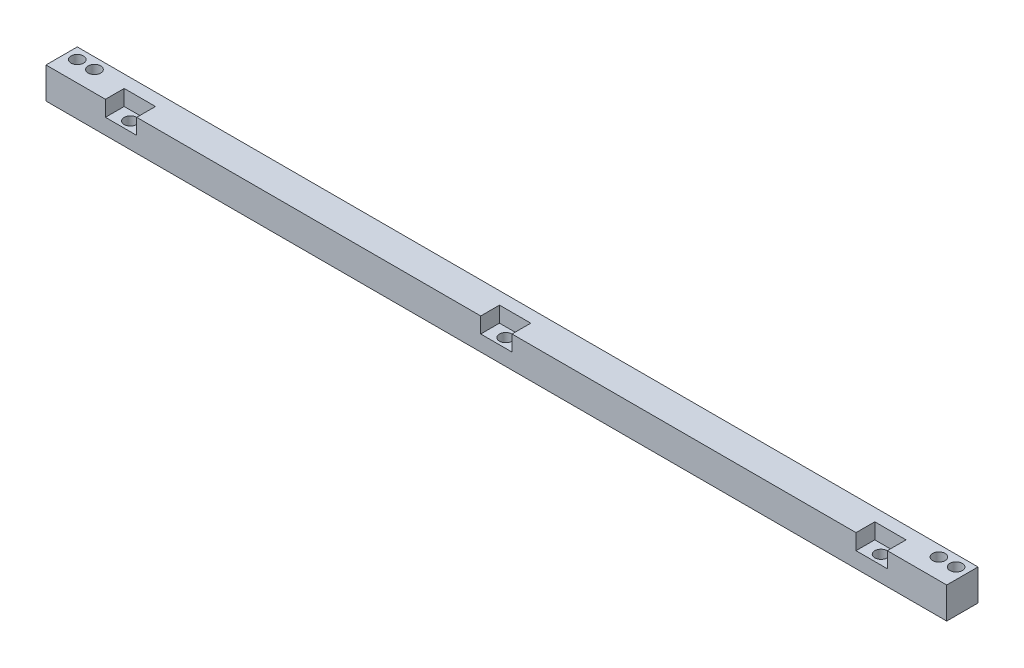
ISO-10303-21;
HEADER;
FILE_DESCRIPTION(('STEP AP214'),'2;1');
FILE_NAME('part.step','',(''),(''),'','','');
FILE_SCHEMA(('AUTOMOTIVE_DESIGN { 1 0 10303 214 1 1 1 1 }'));
ENDSEC;
DATA;
#1=APPLICATION_CONTEXT('core data for automotive mechanical design processes');
#2=APPLICATION_PROTOCOL_DEFINITION('international standard','automotive_design',2000,#1);
#3=PRODUCT_CONTEXT('',#1,'mechanical');
#4=PRODUCT('Part','Part','',(#3));
#5=PRODUCT_RELATED_PRODUCT_CATEGORY('part','',(#4));
#6=PRODUCT_DEFINITION_FORMATION('','',#4);
#7=PRODUCT_DEFINITION_CONTEXT('part definition',#1,'design');
#8=PRODUCT_DEFINITION('design','',#6,#7);
#9=PRODUCT_DEFINITION_SHAPE('','',#8);
#10=(LENGTH_UNIT() NAMED_UNIT(*) SI_UNIT(.MILLI.,.METRE.));
#11=(NAMED_UNIT(*) PLANE_ANGLE_UNIT() SI_UNIT($,.RADIAN.));
#12=(NAMED_UNIT(*) SI_UNIT($,.STERADIAN.) SOLID_ANGLE_UNIT());
#13=UNCERTAINTY_MEASURE_WITH_UNIT(LENGTH_MEASURE(1.E-05),#10,'distance_accuracy_value','');
#14=(GEOMETRIC_REPRESENTATION_CONTEXT(3) GLOBAL_UNCERTAINTY_ASSIGNED_CONTEXT((#13)) GLOBAL_UNIT_ASSIGNED_CONTEXT((#10,
#11,#12)) REPRESENTATION_CONTEXT('',''));
#15=CARTESIAN_POINT('',(0.,0.,0.));
#16=DIRECTION('',(0.,0.,1.));
#17=DIRECTION('',(1.,0.,0.));
#18=AXIS2_PLACEMENT_3D('',#15,#16,#17);
#19=CARTESIAN_POINT('',(0.,25.4,0.));
#20=DIRECTION('',(1.,0.,0.));
#21=DIRECTION('',(0.,0.,-1.));
#22=AXIS2_PLACEMENT_3D('',#19,#20,#21);
#23=PLANE('',#22);
#24=DIRECTION('',(0.,0.,1.));
#25=VECTOR('',#24,1.);
#26=CARTESIAN_POINT('',(0.,0.,0.));
#27=LINE('',#26,#25);
#28=CARTESIAN_POINT('',(0.,0.,-25.4));
#29=VERTEX_POINT('',#28);
#30=CARTESIAN_POINT('',(0.,0.,0.));
#31=VERTEX_POINT('',#30);
#32=EDGE_CURVE('E269',#29,#31,#27,.T.);
#33=ORIENTED_EDGE('',*,*,#32,.T.);
#34=DIRECTION('',(0.,-1.,0.));
#35=VECTOR('',#34,1.);
#36=CARTESIAN_POINT('',(0.,25.4,0.));
#37=LINE('',#36,#35);
#38=CARTESIAN_POINT('',(0.,25.4,0.));
#39=VERTEX_POINT('',#38);
#40=EDGE_CURVE('E11',#39,#31,#37,.T.);
#41=ORIENTED_EDGE('',*,*,#40,.F.);
#42=DIRECTION('',(0.,0.,1.));
#43=VECTOR('',#42,1.);
#44=CARTESIAN_POINT('',(0.,25.4,0.));
#45=LINE('',#44,#43);
#46=CARTESIAN_POINT('',(0.,25.4,-25.4));
#47=VERTEX_POINT('',#46);
#48=EDGE_CURVE('E255',#47,#39,#45,.T.);
#49=ORIENTED_EDGE('',*,*,#48,.F.);
#50=DIRECTION('',(0.,-1.,0.));
#51=VECTOR('',#50,1.);
#52=CARTESIAN_POINT('',(0.,25.4,-25.4));
#53=LINE('',#52,#51);
#54=EDGE_CURVE('E268',#47,#29,#53,.T.);
#55=ORIENTED_EDGE('',*,*,#54,.T.);
#56=EDGE_LOOP('',(#33,#41,#49,#55));
#57=FACE_BOUND('',#56,.T.);
#58=ADVANCED_FACE('F33',(#57),#23,.F.);
#59=CARTESIAN_POINT('',(0.,25.4,0.));
#60=DIRECTION('',(0.,0.,-1.));
#61=DIRECTION('',(-1.,0.,0.));
#62=AXIS2_PLACEMENT_3D('',#59,#60,#61);
#63=PLANE('',#62);
#64=DIRECTION('',(1.,0.,0.));
#65=VECTOR('',#64,1.);
#66=CARTESIAN_POINT('',(0.,25.4,0.));
#67=LINE('',#66,#65);
#68=CARTESIAN_POINT('',(683.26,25.4,0.));
#69=VERTEX_POINT('',#68);
#70=CARTESIAN_POINT('',(731.52,25.4,0.));
#71=VERTEX_POINT('',#70);
#72=EDGE_CURVE('E258',#69,#71,#67,.T.);
#73=ORIENTED_EDGE('',*,*,#72,.F.);
#74=DIRECTION('',(0.,1.,0.));
#75=VECTOR('',#74,1.);
#76=CARTESIAN_POINT('',(683.26,12.7,0.));
#77=LINE('',#76,#75);
#78=CARTESIAN_POINT('',(683.26,12.7,0.));
#79=VERTEX_POINT('',#78);
#80=EDGE_CURVE('E180',#79,#69,#77,.T.);
#81=ORIENTED_EDGE('',*,*,#80,.F.);
#82=DIRECTION('',(1.,0.,0.));
#83=VECTOR('',#82,1.);
#84=CARTESIAN_POINT('',(683.26,12.7,0.));
#85=LINE('',#84,#83);
#86=CARTESIAN_POINT('',(657.86,12.7,0.));
#87=VERTEX_POINT('',#86);
#88=EDGE_CURVE('E154',#87,#79,#85,.T.);
#89=ORIENTED_EDGE('',*,*,#88,.F.);
#90=DIRECTION('',(0.,1.,0.));
#91=VECTOR('',#90,1.);
#92=CARTESIAN_POINT('',(657.86,12.7,0.));
#93=LINE('',#92,#91);
#94=CARTESIAN_POINT('',(657.86,25.4,0.));
#95=VERTEX_POINT('',#94);
#96=EDGE_CURVE('E183',#87,#95,#93,.T.);
#97=ORIENTED_EDGE('',*,*,#96,.T.);
#98=CARTESIAN_POINT('',(378.46,25.4,0.));
#99=VERTEX_POINT('',#98);
#100=EDGE_CURVE('E330',#99,#95,#67,.T.);
#101=ORIENTED_EDGE('',*,*,#100,.F.);
#102=DIRECTION('',(0.,1.,0.));
#103=VECTOR('',#102,1.);
#104=CARTESIAN_POINT('',(378.46,12.7,0.));
#105=LINE('',#104,#103);
#106=CARTESIAN_POINT('',(378.46,12.7,0.));
#107=VERTEX_POINT('',#106);
#108=EDGE_CURVE('E178',#107,#99,#105,.T.);
#109=ORIENTED_EDGE('',*,*,#108,.F.);
#110=DIRECTION('',(1.,0.,0.));
#111=VECTOR('',#110,1.);
#112=CARTESIAN_POINT('',(353.06,12.7,0.));
#113=LINE('',#112,#111);
#114=CARTESIAN_POINT('',(353.06,12.7,0.));
#115=VERTEX_POINT('',#114);
#116=EDGE_CURVE('E197',#115,#107,#113,.T.);
#117=ORIENTED_EDGE('',*,*,#116,.F.);
#118=DIRECTION('',(0.,1.,0.));
#119=VECTOR('',#118,1.);
#120=CARTESIAN_POINT('',(353.06,12.7,0.));
#121=LINE('',#120,#119);
#122=CARTESIAN_POINT('',(353.06,25.4,0.));
#123=VERTEX_POINT('',#122);
#124=EDGE_CURVE('E207',#115,#123,#121,.T.);
#125=ORIENTED_EDGE('',*,*,#124,.T.);
#126=CARTESIAN_POINT('',(73.66,25.4,0.));
#127=VERTEX_POINT('',#126);
#128=EDGE_CURVE('E264',#127,#123,#67,.T.);
#129=ORIENTED_EDGE('',*,*,#128,.F.);
#130=DIRECTION('',(0.,1.,0.));
#131=VECTOR('',#130,1.);
#132=CARTESIAN_POINT('',(73.66,12.7,0.));
#133=LINE('',#132,#131);
#134=CARTESIAN_POINT('',(73.66,12.7,0.));
#135=VERTEX_POINT('',#134);
#136=EDGE_CURVE('E238',#135,#127,#133,.T.);
#137=ORIENTED_EDGE('',*,*,#136,.F.);
#138=DIRECTION('',(1.,0.,0.));
#139=VECTOR('',#138,1.);
#140=CARTESIAN_POINT('',(48.26,12.7,0.));
#141=LINE('',#140,#139);
#142=CARTESIAN_POINT('',(48.26,12.7,0.));
#143=VERTEX_POINT('',#142);
#144=EDGE_CURVE('E216',#143,#135,#141,.T.);
#145=ORIENTED_EDGE('',*,*,#144,.F.);
#146=DIRECTION('',(0.,1.,0.));
#147=VECTOR('',#146,1.);
#148=CARTESIAN_POINT('',(48.26,12.7,0.));
#149=LINE('',#148,#147);
#150=CARTESIAN_POINT('',(48.26,25.4,0.));
#151=VERTEX_POINT('',#150);
#152=EDGE_CURVE('E226',#143,#151,#149,.T.);
#153=ORIENTED_EDGE('',*,*,#152,.T.);
#154=EDGE_CURVE('E260',#39,#151,#67,.T.);
#155=ORIENTED_EDGE('',*,*,#154,.F.);
#156=ORIENTED_EDGE('',*,*,#40,.T.);
#157=DIRECTION('',(1.,0.,0.));
#158=VECTOR('',#157,1.);
#159=CARTESIAN_POINT('',(0.,0.,0.));
#160=LINE('',#159,#158);
#161=CARTESIAN_POINT('',(731.52,0.,0.));
#162=VERTEX_POINT('',#161);
#163=EDGE_CURVE('E272',#31,#162,#160,.T.);
#164=ORIENTED_EDGE('',*,*,#163,.T.);
#165=DIRECTION('',(0.,-1.,0.));
#166=VECTOR('',#165,1.);
#167=CARTESIAN_POINT('',(731.52,25.4,0.));
#168=LINE('',#167,#166);
#169=EDGE_CURVE('E41',#71,#162,#168,.T.);
#170=ORIENTED_EDGE('',*,*,#169,.F.);
#171=EDGE_LOOP('',(#73,#81,#89,#97,#101,#109,#117,#125,#129,#137,#145,#153,#155,#156,#164,#170));
#172=FACE_BOUND('',#171,.T.);
#173=ADVANCED_FACE('F326',(#172),#63,.F.);
#174=CARTESIAN_POINT('',(731.52,25.4,0.));
#175=DIRECTION('',(-1.,0.,0.));
#176=DIRECTION('',(0.,0.,1.));
#177=AXIS2_PLACEMENT_3D('',#174,#175,#176);
#178=PLANE('',#177);
#179=DIRECTION('',(0.,0.,-1.));
#180=VECTOR('',#179,1.);
#181=CARTESIAN_POINT('',(731.52,0.,0.));
#182=LINE('',#181,#180);
#183=CARTESIAN_POINT('',(731.52,0.,-25.4));
#184=VERTEX_POINT('',#183);
#185=EDGE_CURVE('E274',#162,#184,#182,.T.);
#186=ORIENTED_EDGE('',*,*,#185,.T.);
#187=DIRECTION('',(0.,-1.,0.));
#188=VECTOR('',#187,1.);
#189=CARTESIAN_POINT('',(731.52,25.4,-25.4));
#190=LINE('',#189,#188);
#191=CARTESIAN_POINT('',(731.52,25.4,-25.4));
#192=VERTEX_POINT('',#191);
#193=EDGE_CURVE('E279',#192,#184,#190,.T.);
#194=ORIENTED_EDGE('',*,*,#193,.F.);
#195=DIRECTION('',(0.,0.,-1.));
#196=VECTOR('',#195,1.);
#197=CARTESIAN_POINT('',(731.52,25.4,0.));
#198=LINE('',#197,#196);
#199=EDGE_CURVE('E263',#71,#192,#198,.T.);
#200=ORIENTED_EDGE('',*,*,#199,.F.);
#201=ORIENTED_EDGE('',*,*,#169,.T.);
#202=EDGE_LOOP('',(#186,#194,#200,#201));
#203=FACE_BOUND('',#202,.T.);
#204=ADVANCED_FACE('F322',(#203),#178,.F.);
#205=CARTESIAN_POINT('',(0.,25.4,-25.4));
#206=DIRECTION('',(0.,0.,1.));
#207=DIRECTION('',(1.,0.,0.));
#208=AXIS2_PLACEMENT_3D('',#205,#206,#207);
#209=PLANE('',#208);
#210=DIRECTION('',(-1.,0.,0.));
#211=VECTOR('',#210,1.);
#212=CARTESIAN_POINT('',(0.,0.,-25.4));
#213=LINE('',#212,#211);
#214=EDGE_CURVE('E259',#184,#29,#213,.T.);
#215=ORIENTED_EDGE('',*,*,#214,.T.);
#216=ORIENTED_EDGE('',*,*,#54,.F.);
#217=DIRECTION('',(-1.,0.,0.));
#218=VECTOR('',#217,1.);
#219=CARTESIAN_POINT('',(0.,25.4,-25.4));
#220=LINE('',#219,#218);
#221=EDGE_CURVE('E266',#192,#47,#220,.T.);
#222=ORIENTED_EDGE('',*,*,#221,.F.);
#223=ORIENTED_EDGE('',*,*,#193,.T.);
#224=EDGE_LOOP('',(#215,#216,#222,#223));
#225=FACE_BOUND('',#224,.T.);
#226=ADVANCED_FACE('F318',(#225),#209,.F.);
#227=CARTESIAN_POINT('',(0.,25.4,0.));
#228=DIRECTION('',(0.,-1.,0.));
#229=DIRECTION('',(0.,0.,-1.));
#230=AXIS2_PLACEMENT_3D('',#227,#228,#229);
#231=PLANE('',#230);
#232=CARTESIAN_POINT('',(22.86,25.4,-16.51));
#233=DIRECTION('',(0.,1.,0.));
#234=DIRECTION('',(0.,0.,1.));
#235=AXIS2_PLACEMENT_3D('',#232,#233,#234);
#236=CIRCLE('',#235,5.08);
#237=CARTESIAN_POINT('',(22.86,25.4,-11.43));
#238=VERTEX_POINT('',#237);
#239=EDGE_CURVE('E242',#238,#238,#236,.T.);
#240=ORIENTED_EDGE('',*,*,#239,.F.);
#241=EDGE_LOOP('',(#240));
#242=FACE_BOUND('',#241,.T.);
#243=CARTESIAN_POINT('',(722.63,25.4,-16.51));
#244=DIRECTION('',(0.,1.,0.));
#245=DIRECTION('',(0.,0.,1.));
#246=AXIS2_PLACEMENT_3D('',#243,#244,#245);
#247=CIRCLE('',#246,5.08000000000002);
#248=CARTESIAN_POINT('',(722.63,25.4,-11.43));
#249=VERTEX_POINT('',#248);
#250=EDGE_CURVE('E246',#249,#249,#247,.T.);
#251=ORIENTED_EDGE('',*,*,#250,.F.);
#252=EDGE_LOOP('',(#251));
#253=FACE_BOUND('',#252,.T.);
#254=CARTESIAN_POINT('',(708.66,25.4,-16.51));
#255=DIRECTION('',(0.,1.,0.));
#256=DIRECTION('',(0.,0.,1.));
#257=AXIS2_PLACEMENT_3D('',#254,#255,#256);
#258=CIRCLE('',#257,5.08000000000002);
#259=CARTESIAN_POINT('',(708.66,25.4,-11.43));
#260=VERTEX_POINT('',#259);
#261=EDGE_CURVE('E235',#260,#260,#258,.T.);
#262=ORIENTED_EDGE('',*,*,#261,.F.);
#263=EDGE_LOOP('',(#262));
#264=FACE_BOUND('',#263,.T.);
#265=CARTESIAN_POINT('',(8.89,25.4,-16.51));
#266=DIRECTION('',(0.,1.,0.));
#267=DIRECTION('',(0.,0.,1.));
#268=AXIS2_PLACEMENT_3D('',#265,#266,#267);
#269=CIRCLE('',#268,5.08);
#270=CARTESIAN_POINT('',(8.89,25.4,-11.43));
#271=VERTEX_POINT('',#270);
#272=EDGE_CURVE('E251',#271,#271,#269,.T.);
#273=ORIENTED_EDGE('',*,*,#272,.F.);
#274=EDGE_LOOP('',(#273));
#275=FACE_BOUND('',#274,.T.);
#276=DIRECTION('',(-1.,0.,0.));
#277=VECTOR('',#276,1.);
#278=CARTESIAN_POINT('',(683.26,25.4,-15.24));
#279=LINE('',#278,#277);
#280=CARTESIAN_POINT('',(683.26,25.4,-15.24));
#281=VERTEX_POINT('',#280);
#282=CARTESIAN_POINT('',(657.86,25.4,-15.24));
#283=VERTEX_POINT('',#282);
#284=EDGE_CURVE('E169',#281,#283,#279,.T.);
#285=ORIENTED_EDGE('',*,*,#284,.F.);
#286=DIRECTION('',(0.,0.,-1.));
#287=VECTOR('',#286,1.);
#288=CARTESIAN_POINT('',(683.26,25.4,0.));
#289=LINE('',#288,#287);
#290=EDGE_CURVE('E49',#69,#281,#289,.T.);
#291=ORIENTED_EDGE('',*,*,#290,.F.);
#292=ORIENTED_EDGE('',*,*,#72,.T.);
#293=ORIENTED_EDGE('',*,*,#199,.T.);
#294=ORIENTED_EDGE('',*,*,#221,.T.);
#295=ORIENTED_EDGE('',*,*,#48,.T.);
#296=ORIENTED_EDGE('',*,*,#154,.T.);
#297=DIRECTION('',(0.,0.,1.));
#298=VECTOR('',#297,1.);
#299=CARTESIAN_POINT('',(48.26,25.4,0.));
#300=LINE('',#299,#298);
#301=CARTESIAN_POINT('',(48.26,25.4,-15.24));
#302=VERTEX_POINT('',#301);
#303=EDGE_CURVE('E182',#302,#151,#300,.T.);
#304=ORIENTED_EDGE('',*,*,#303,.F.);
#305=DIRECTION('',(-1.,0.,0.));
#306=VECTOR('',#305,1.);
#307=CARTESIAN_POINT('',(48.26,25.4,-15.24));
#308=LINE('',#307,#306);
#309=CARTESIAN_POINT('',(73.66,25.4,-15.24));
#310=VERTEX_POINT('',#309);
#311=EDGE_CURVE('E217',#310,#302,#308,.T.);
#312=ORIENTED_EDGE('',*,*,#311,.F.);
#313=DIRECTION('',(0.,0.,-1.));
#314=VECTOR('',#313,1.);
#315=CARTESIAN_POINT('',(73.66,25.4,0.));
#316=LINE('',#315,#314);
#317=EDGE_CURVE('E228',#127,#310,#316,.T.);
#318=ORIENTED_EDGE('',*,*,#317,.F.);
#319=ORIENTED_EDGE('',*,*,#128,.T.);
#320=DIRECTION('',(0.,0.,1.));
#321=VECTOR('',#320,1.);
#322=CARTESIAN_POINT('',(353.06,25.4,0.));
#323=LINE('',#322,#321);
#324=CARTESIAN_POINT('',(353.06,25.4,-15.24));
#325=VERTEX_POINT('',#324);
#326=EDGE_CURVE('E191',#325,#123,#323,.T.);
#327=ORIENTED_EDGE('',*,*,#326,.F.);
#328=DIRECTION('',(-1.,0.,0.));
#329=VECTOR('',#328,1.);
#330=CARTESIAN_POINT('',(353.06,25.4,-15.24));
#331=LINE('',#330,#329);
#332=CARTESIAN_POINT('',(378.46,25.4,-15.24));
#333=VERTEX_POINT('',#332);
#334=EDGE_CURVE('E202',#333,#325,#331,.T.);
#335=ORIENTED_EDGE('',*,*,#334,.F.);
#336=DIRECTION('',(0.,0.,-1.));
#337=VECTOR('',#336,1.);
#338=CARTESIAN_POINT('',(378.46,25.4,0.));
#339=LINE('',#338,#337);
#340=EDGE_CURVE('E57',#99,#333,#339,.T.);
#341=ORIENTED_EDGE('',*,*,#340,.F.);
#342=ORIENTED_EDGE('',*,*,#100,.T.);
#343=DIRECTION('',(0.,0.,1.));
#344=VECTOR('',#343,1.);
#345=CARTESIAN_POINT('',(657.86,25.4,0.));
#346=LINE('',#345,#344);
#347=EDGE_CURVE('E167',#283,#95,#346,.T.);
#348=ORIENTED_EDGE('',*,*,#347,.F.);
#349=EDGE_LOOP('',(#285,#291,#292,#293,#294,#295,#296,#304,#312,#318,#319,#327,#335,#341,#342,#348));
#350=FACE_BOUND('',#349,.T.);
#351=ADVANCED_FACE('F301',(#242,#253,#264,#275,#350),#231,.F.);
#352=CARTESIAN_POINT('',(0.,0.,0.));
#353=DIRECTION('',(0.,-1.,0.));
#354=DIRECTION('',(0.,0.,-1.));
#355=AXIS2_PLACEMENT_3D('',#352,#353,#354);
#356=PLANE('',#355);
#357=CARTESIAN_POINT('',(670.56,0.,-7.62));
#358=DIRECTION('',(0.,-1.,0.));
#359=DIRECTION('',(0.,0.,-1.));
#360=AXIS2_PLACEMENT_3D('',#357,#358,#359);
#361=CIRCLE('',#360,5.08000000000002);
#362=CARTESIAN_POINT('',(670.56,0.,-2.53999999999998));
#363=VERTEX_POINT('',#362);
#364=EDGE_CURVE('E422',#363,#363,#361,.T.);
#365=ORIENTED_EDGE('',*,*,#364,.F.);
#366=EDGE_LOOP('',(#365));
#367=FACE_BOUND('',#366,.T.);
#368=CARTESIAN_POINT('',(365.76,0.,-7.62));
#369=DIRECTION('',(0.,-1.,0.));
#370=DIRECTION('',(0.,0.,-1.));
#371=AXIS2_PLACEMENT_3D('',#368,#369,#370);
#372=CIRCLE('',#371,5.07999999999996);
#373=CARTESIAN_POINT('',(365.76,0.,-2.54000000000004));
#374=VERTEX_POINT('',#373);
#375=EDGE_CURVE('E427',#374,#374,#372,.T.);
#376=ORIENTED_EDGE('',*,*,#375,.F.);
#377=EDGE_LOOP('',(#376));
#378=FACE_BOUND('',#377,.T.);
#379=CARTESIAN_POINT('',(60.96,0.,-7.62));
#380=DIRECTION('',(0.,-1.,0.));
#381=DIRECTION('',(0.,0.,-1.));
#382=AXIS2_PLACEMENT_3D('',#379,#380,#381);
#383=CIRCLE('',#382,5.08000000000001);
#384=CARTESIAN_POINT('',(60.96,0.,-2.53999999999999));
#385=VERTEX_POINT('',#384);
#386=EDGE_CURVE('E172',#385,#385,#383,.T.);
#387=ORIENTED_EDGE('',*,*,#386,.F.);
#388=EDGE_LOOP('',(#387));
#389=FACE_BOUND('',#388,.T.);
#390=CARTESIAN_POINT('',(22.86,0.,-16.51));
#391=DIRECTION('',(0.,-1.,0.));
#392=DIRECTION('',(0.,0.,-1.));
#393=AXIS2_PLACEMENT_3D('',#390,#391,#392);
#394=CIRCLE('',#393,5.08);
#395=CARTESIAN_POINT('',(22.86,0.,-21.59));
#396=VERTEX_POINT('',#395);
#397=EDGE_CURVE('E36',#396,#396,#394,.T.);
#398=ORIENTED_EDGE('',*,*,#397,.F.);
#399=EDGE_LOOP('',(#398));
#400=FACE_BOUND('',#399,.T.);
#401=CARTESIAN_POINT('',(722.63,0.,-16.51));
#402=DIRECTION('',(0.,-1.,0.));
#403=DIRECTION('',(0.,0.,-1.));
#404=AXIS2_PLACEMENT_3D('',#401,#402,#403);
#405=CIRCLE('',#404,5.08000000000002);
#406=CARTESIAN_POINT('',(722.63,0.,-21.59));
#407=VERTEX_POINT('',#406);
#408=EDGE_CURVE('E287',#407,#407,#405,.T.);
#409=ORIENTED_EDGE('',*,*,#408,.F.);
#410=EDGE_LOOP('',(#409));
#411=FACE_BOUND('',#410,.T.);
#412=CARTESIAN_POINT('',(708.66,0.,-16.51));
#413=DIRECTION('',(0.,-1.,0.));
#414=DIRECTION('',(0.,0.,-1.));
#415=AXIS2_PLACEMENT_3D('',#412,#413,#414);
#416=CIRCLE('',#415,5.08000000000002);
#417=CARTESIAN_POINT('',(708.66,0.,-21.59));
#418=VERTEX_POINT('',#417);
#419=EDGE_CURVE('E245',#418,#418,#416,.T.);
#420=ORIENTED_EDGE('',*,*,#419,.F.);
#421=EDGE_LOOP('',(#420));
#422=FACE_BOUND('',#421,.T.);
#423=CARTESIAN_POINT('',(8.89,0.,-16.51));
#424=DIRECTION('',(0.,-1.,0.));
#425=DIRECTION('',(0.,0.,-1.));
#426=AXIS2_PLACEMENT_3D('',#423,#424,#425);
#427=CIRCLE('',#426,5.08);
#428=CARTESIAN_POINT('',(8.89,0.,-21.59));
#429=VERTEX_POINT('',#428);
#430=EDGE_CURVE('E254',#429,#429,#427,.T.);
#431=ORIENTED_EDGE('',*,*,#430,.F.);
#432=EDGE_LOOP('',(#431));
#433=FACE_BOUND('',#432,.T.);
#434=ORIENTED_EDGE('',*,*,#32,.F.);
#435=ORIENTED_EDGE('',*,*,#214,.F.);
#436=ORIENTED_EDGE('',*,*,#185,.F.);
#437=ORIENTED_EDGE('',*,*,#163,.F.);
#438=EDGE_LOOP('',(#434,#435,#436,#437));
#439=FACE_BOUND('',#438,.T.);
#440=ADVANCED_FACE('F297',(#367,#378,#389,#400,#411,#422,#433,#439),#356,.T.);
#441=CARTESIAN_POINT('',(8.89,-2.54,-16.51));
#442=DIRECTION('',(0.,1.,0.));
#443=DIRECTION('',(0.,0.,1.));
#444=AXIS2_PLACEMENT_3D('',#441,#442,#443);
#445=CYLINDRICAL_SURFACE('',#444,5.08);
#446=ORIENTED_EDGE('',*,*,#430,.T.);
#447=EDGE_LOOP('',(#446));
#448=FACE_BOUND('',#447,.T.);
#449=ORIENTED_EDGE('',*,*,#272,.T.);
#450=EDGE_LOOP('',(#449));
#451=FACE_BOUND('',#450,.T.);
#452=ADVANCED_FACE('F300',(#448,#451),#445,.F.);
#453=CARTESIAN_POINT('',(708.66,-2.54,-16.51));
#454=DIRECTION('',(0.,1.,0.));
#455=DIRECTION('',(0.,0.,1.));
#456=AXIS2_PLACEMENT_3D('',#453,#454,#455);
#457=CYLINDRICAL_SURFACE('',#456,5.08000000000002);
#458=ORIENTED_EDGE('',*,*,#419,.T.);
#459=EDGE_LOOP('',(#458));
#460=FACE_BOUND('',#459,.T.);
#461=ORIENTED_EDGE('',*,*,#261,.T.);
#462=EDGE_LOOP('',(#461));
#463=FACE_BOUND('',#462,.T.);
#464=ADVANCED_FACE('F378',(#460,#463),#457,.F.);
#465=CARTESIAN_POINT('',(722.63,-2.54,-16.51));
#466=DIRECTION('',(0.,1.,0.));
#467=DIRECTION('',(0.,0.,1.));
#468=AXIS2_PLACEMENT_3D('',#465,#466,#467);
#469=CYLINDRICAL_SURFACE('',#468,5.08000000000002);
#470=ORIENTED_EDGE('',*,*,#408,.T.);
#471=EDGE_LOOP('',(#470));
#472=FACE_BOUND('',#471,.T.);
#473=ORIENTED_EDGE('',*,*,#250,.T.);
#474=EDGE_LOOP('',(#473));
#475=FACE_BOUND('',#474,.T.);
#476=ADVANCED_FACE('F382',(#472,#475),#469,.F.);
#477=CARTESIAN_POINT('',(22.86,-2.54,-16.51));
#478=DIRECTION('',(0.,1.,0.));
#479=DIRECTION('',(0.,0.,1.));
#480=AXIS2_PLACEMENT_3D('',#477,#478,#479);
#481=CYLINDRICAL_SURFACE('',#480,5.08);
#482=ORIENTED_EDGE('',*,*,#397,.T.);
#483=EDGE_LOOP('',(#482));
#484=FACE_BOUND('',#483,.T.);
#485=ORIENTED_EDGE('',*,*,#239,.T.);
#486=EDGE_LOOP('',(#485));
#487=FACE_BOUND('',#486,.T.);
#488=ADVANCED_FACE('F294',(#484,#487),#481,.F.);
#489=CARTESIAN_POINT('',(48.26,12.7,0.));
#490=DIRECTION('',(-1.,0.,0.));
#491=DIRECTION('',(0.,0.,1.));
#492=AXIS2_PLACEMENT_3D('',#489,#490,#491);
#493=PLANE('',#492);
#494=ORIENTED_EDGE('',*,*,#303,.T.);
#495=ORIENTED_EDGE('',*,*,#152,.F.);
#496=DIRECTION('',(0.,0.,1.));
#497=VECTOR('',#496,1.);
#498=CARTESIAN_POINT('',(48.26,12.7,0.));
#499=LINE('',#498,#497);
#500=CARTESIAN_POINT('',(48.26,12.7,-15.24));
#501=VERTEX_POINT('',#500);
#502=EDGE_CURVE('E213',#501,#143,#499,.T.);
#503=ORIENTED_EDGE('',*,*,#502,.F.);
#504=DIRECTION('',(0.,1.,0.));
#505=VECTOR('',#504,1.);
#506=CARTESIAN_POINT('',(48.26,12.7,-15.24));
#507=LINE('',#506,#505);
#508=EDGE_CURVE('E233',#501,#302,#507,.T.);
#509=ORIENTED_EDGE('',*,*,#508,.T.);
#510=EDGE_LOOP('',(#494,#495,#503,#509));
#511=FACE_BOUND('',#510,.T.);
#512=ADVANCED_FACE('F388',(#511),#493,.F.);
#513=CARTESIAN_POINT('',(48.26,12.7,-15.24));
#514=DIRECTION('',(0.,0.,-1.));
#515=DIRECTION('',(-1.,0.,0.));
#516=AXIS2_PLACEMENT_3D('',#513,#514,#515);
#517=PLANE('',#516);
#518=ORIENTED_EDGE('',*,*,#311,.T.);
#519=ORIENTED_EDGE('',*,*,#508,.F.);
#520=DIRECTION('',(-1.,0.,0.));
#521=VECTOR('',#520,1.);
#522=CARTESIAN_POINT('',(48.26,12.7,-15.24));
#523=LINE('',#522,#521);
#524=CARTESIAN_POINT('',(73.66,12.7,-15.24));
#525=VERTEX_POINT('',#524);
#526=EDGE_CURVE('E223',#525,#501,#523,.T.);
#527=ORIENTED_EDGE('',*,*,#526,.F.);
#528=DIRECTION('',(0.,1.,0.));
#529=VECTOR('',#528,1.);
#530=CARTESIAN_POINT('',(73.66,12.7,-15.24));
#531=LINE('',#530,#529);
#532=EDGE_CURVE('E236',#525,#310,#531,.T.);
#533=ORIENTED_EDGE('',*,*,#532,.T.);
#534=EDGE_LOOP('',(#518,#519,#527,#533));
#535=FACE_BOUND('',#534,.T.);
#536=ADVANCED_FACE('F391',(#535),#517,.F.);
#537=CARTESIAN_POINT('',(73.66,12.7,0.));
#538=DIRECTION('',(1.,0.,0.));
#539=DIRECTION('',(0.,0.,-1.));
#540=AXIS2_PLACEMENT_3D('',#537,#538,#539);
#541=PLANE('',#540);
#542=ORIENTED_EDGE('',*,*,#317,.T.);
#543=ORIENTED_EDGE('',*,*,#532,.F.);
#544=DIRECTION('',(0.,0.,-1.));
#545=VECTOR('',#544,1.);
#546=CARTESIAN_POINT('',(73.66,12.7,0.));
#547=LINE('',#546,#545);
#548=EDGE_CURVE('E220',#135,#525,#547,.T.);
#549=ORIENTED_EDGE('',*,*,#548,.F.);
#550=ORIENTED_EDGE('',*,*,#136,.T.);
#551=EDGE_LOOP('',(#542,#543,#549,#550));
#552=FACE_BOUND('',#551,.T.);
#553=ADVANCED_FACE('F393',(#552),#541,.F.);
#554=CARTESIAN_POINT('',(0.,12.7,0.));
#555=DIRECTION('',(0.,-1.,0.));
#556=DIRECTION('',(0.,0.,-1.));
#557=AXIS2_PLACEMENT_3D('',#554,#555,#556);
#558=PLANE('',#557);
#559=CARTESIAN_POINT('',(60.96,12.7,-7.62));
#560=DIRECTION('',(0.,1.,0.));
#561=DIRECTION('',(0.,0.,1.));
#562=AXIS2_PLACEMENT_3D('',#559,#560,#561);
#563=CIRCLE('',#562,5.08000000000001);
#564=CARTESIAN_POINT('',(60.96,12.7,-2.53999999999999));
#565=VERTEX_POINT('',#564);
#566=EDGE_CURVE('E429',#565,#565,#563,.T.);
#567=ORIENTED_EDGE('',*,*,#566,.F.);
#568=EDGE_LOOP('',(#567));
#569=FACE_BOUND('',#568,.T.);
#570=ORIENTED_EDGE('',*,*,#502,.T.);
#571=ORIENTED_EDGE('',*,*,#144,.T.);
#572=ORIENTED_EDGE('',*,*,#548,.T.);
#573=ORIENTED_EDGE('',*,*,#526,.T.);
#574=EDGE_LOOP('',(#570,#571,#572,#573));
#575=FACE_BOUND('',#574,.T.);
#576=ADVANCED_FACE('F396',(#569,#575),#558,.F.);
#577=CARTESIAN_POINT('',(378.46,12.7,0.));
#578=DIRECTION('',(1.,0.,0.));
#579=DIRECTION('',(0.,0.,-1.));
#580=AXIS2_PLACEMENT_3D('',#577,#578,#579);
#581=PLANE('',#580);
#582=ORIENTED_EDGE('',*,*,#340,.T.);
#583=DIRECTION('',(0.,1.,0.));
#584=VECTOR('',#583,1.);
#585=CARTESIAN_POINT('',(378.46,12.7,-15.24));
#586=LINE('',#585,#584);
#587=CARTESIAN_POINT('',(378.46,12.7,-15.24));
#588=VERTEX_POINT('',#587);
#589=EDGE_CURVE('E200',#588,#333,#586,.T.);
#590=ORIENTED_EDGE('',*,*,#589,.F.);
#591=DIRECTION('',(0.,0.,-1.));
#592=VECTOR('',#591,1.);
#593=CARTESIAN_POINT('',(378.46,12.7,0.));
#594=LINE('',#593,#592);
#595=EDGE_CURVE('E187',#107,#588,#594,.T.);
#596=ORIENTED_EDGE('',*,*,#595,.F.);
#597=ORIENTED_EDGE('',*,*,#108,.T.);
#598=EDGE_LOOP('',(#582,#590,#596,#597));
#599=FACE_BOUND('',#598,.T.);
#600=ADVANCED_FACE('F403',(#599),#581,.F.);
#601=CARTESIAN_POINT('',(353.06,12.7,0.));
#602=DIRECTION('',(-1.,0.,0.));
#603=DIRECTION('',(0.,0.,1.));
#604=AXIS2_PLACEMENT_3D('',#601,#602,#603);
#605=PLANE('',#604);
#606=ORIENTED_EDGE('',*,*,#326,.T.);
#607=ORIENTED_EDGE('',*,*,#124,.F.);
#608=DIRECTION('',(0.,0.,1.));
#609=VECTOR('',#608,1.);
#610=CARTESIAN_POINT('',(353.06,12.7,0.));
#611=LINE('',#610,#609);
#612=CARTESIAN_POINT('',(353.06,12.7,-15.24));
#613=VERTEX_POINT('',#612);
#614=EDGE_CURVE('E194',#613,#115,#611,.T.);
#615=ORIENTED_EDGE('',*,*,#614,.F.);
#616=DIRECTION('',(0.,1.,0.));
#617=VECTOR('',#616,1.);
#618=CARTESIAN_POINT('',(353.06,12.7,-15.24));
#619=LINE('',#618,#617);
#620=EDGE_CURVE('E210',#613,#325,#619,.T.);
#621=ORIENTED_EDGE('',*,*,#620,.T.);
#622=EDGE_LOOP('',(#606,#607,#615,#621));
#623=FACE_BOUND('',#622,.T.);
#624=ADVANCED_FACE('F345',(#623),#605,.F.);
#625=CARTESIAN_POINT('',(353.06,12.7,-15.24));
#626=DIRECTION('',(0.,0.,-1.));
#627=DIRECTION('',(-1.,0.,0.));
#628=AXIS2_PLACEMENT_3D('',#625,#626,#627);
#629=PLANE('',#628);
#630=ORIENTED_EDGE('',*,*,#334,.T.);
#631=ORIENTED_EDGE('',*,*,#620,.F.);
#632=DIRECTION('',(-1.,0.,0.));
#633=VECTOR('',#632,1.);
#634=CARTESIAN_POINT('',(353.06,12.7,-15.24));
#635=LINE('',#634,#633);
#636=EDGE_CURVE('E190',#588,#613,#635,.T.);
#637=ORIENTED_EDGE('',*,*,#636,.F.);
#638=ORIENTED_EDGE('',*,*,#589,.T.);
#639=EDGE_LOOP('',(#630,#631,#637,#638));
#640=FACE_BOUND('',#639,.T.);
#641=ADVANCED_FACE('F350',(#640),#629,.F.);
#642=CARTESIAN_POINT('',(0.,12.7,0.));
#643=DIRECTION('',(0.,-1.,0.));
#644=DIRECTION('',(0.,0.,-1.));
#645=AXIS2_PLACEMENT_3D('',#642,#643,#644);
#646=PLANE('',#645);
#647=CARTESIAN_POINT('',(365.76,12.7,-7.62));
#648=DIRECTION('',(0.,1.,0.));
#649=DIRECTION('',(0.,0.,1.));
#650=AXIS2_PLACEMENT_3D('',#647,#648,#649);
#651=CIRCLE('',#650,5.07999999999996);
#652=CARTESIAN_POINT('',(365.76,12.7,-2.54000000000004));
#653=VERTEX_POINT('',#652);
#654=EDGE_CURVE('E417',#653,#653,#651,.T.);
#655=ORIENTED_EDGE('',*,*,#654,.F.);
#656=EDGE_LOOP('',(#655));
#657=FACE_BOUND('',#656,.T.);
#658=ORIENTED_EDGE('',*,*,#595,.T.);
#659=ORIENTED_EDGE('',*,*,#636,.T.);
#660=ORIENTED_EDGE('',*,*,#614,.T.);
#661=ORIENTED_EDGE('',*,*,#116,.T.);
#662=EDGE_LOOP('',(#658,#659,#660,#661));
#663=FACE_BOUND('',#662,.T.);
#664=ADVANCED_FACE('F347',(#657,#663),#646,.F.);
#665=CARTESIAN_POINT('',(683.26,12.7,0.));
#666=DIRECTION('',(1.,0.,0.));
#667=DIRECTION('',(0.,0.,-1.));
#668=AXIS2_PLACEMENT_3D('',#665,#666,#667);
#669=PLANE('',#668);
#670=ORIENTED_EDGE('',*,*,#290,.T.);
#671=DIRECTION('',(0.,1.,0.));
#672=VECTOR('',#671,1.);
#673=CARTESIAN_POINT('',(683.26,12.7,-15.24));
#674=LINE('',#673,#672);
#675=CARTESIAN_POINT('',(683.26,12.7,-15.24));
#676=VERTEX_POINT('',#675);
#677=EDGE_CURVE('E144',#676,#281,#674,.T.);
#678=ORIENTED_EDGE('',*,*,#677,.F.);
#679=DIRECTION('',(0.,0.,-1.));
#680=VECTOR('',#679,1.);
#681=CARTESIAN_POINT('',(683.26,12.7,0.));
#682=LINE('',#681,#680);
#683=EDGE_CURVE('E148',#79,#676,#682,.T.);
#684=ORIENTED_EDGE('',*,*,#683,.F.);
#685=ORIENTED_EDGE('',*,*,#80,.T.);
#686=EDGE_LOOP('',(#670,#678,#684,#685));
#687=FACE_BOUND('',#686,.T.);
#688=ADVANCED_FACE('F146',(#687),#669,.F.);
#689=CARTESIAN_POINT('',(657.86,12.7,0.));
#690=DIRECTION('',(-1.,0.,0.));
#691=DIRECTION('',(0.,0.,1.));
#692=AXIS2_PLACEMENT_3D('',#689,#690,#691);
#693=PLANE('',#692);
#694=ORIENTED_EDGE('',*,*,#347,.T.);
#695=ORIENTED_EDGE('',*,*,#96,.F.);
#696=DIRECTION('',(0.,0.,1.));
#697=VECTOR('',#696,1.);
#698=CARTESIAN_POINT('',(657.86,12.7,0.));
#699=LINE('',#698,#697);
#700=CARTESIAN_POINT('',(657.86,12.7,-15.24));
#701=VERTEX_POINT('',#700);
#702=EDGE_CURVE('E162',#701,#87,#699,.T.);
#703=ORIENTED_EDGE('',*,*,#702,.F.);
#704=DIRECTION('',(0.,1.,0.));
#705=VECTOR('',#704,1.);
#706=CARTESIAN_POINT('',(657.86,12.7,-15.24));
#707=LINE('',#706,#705);
#708=EDGE_CURVE('E153',#701,#283,#707,.T.);
#709=ORIENTED_EDGE('',*,*,#708,.T.);
#710=EDGE_LOOP('',(#694,#695,#703,#709));
#711=FACE_BOUND('',#710,.T.);
#712=ADVANCED_FACE('F352',(#711),#693,.F.);
#713=CARTESIAN_POINT('',(683.26,12.7,-15.24));
#714=DIRECTION('',(0.,0.,-1.));
#715=DIRECTION('',(-1.,0.,0.));
#716=AXIS2_PLACEMENT_3D('',#713,#714,#715);
#717=PLANE('',#716);
#718=ORIENTED_EDGE('',*,*,#284,.T.);
#719=ORIENTED_EDGE('',*,*,#708,.F.);
#720=DIRECTION('',(-1.,0.,0.));
#721=VECTOR('',#720,1.);
#722=CARTESIAN_POINT('',(683.26,12.7,-15.24));
#723=LINE('',#722,#721);
#724=EDGE_CURVE('E157',#676,#701,#723,.T.);
#725=ORIENTED_EDGE('',*,*,#724,.F.);
#726=ORIENTED_EDGE('',*,*,#677,.T.);
#727=EDGE_LOOP('',(#718,#719,#725,#726));
#728=FACE_BOUND('',#727,.T.);
#729=ADVANCED_FACE('F158',(#728),#717,.F.);
#730=CARTESIAN_POINT('',(0.,12.7,0.));
#731=DIRECTION('',(0.,1.,0.));
#732=DIRECTION('',(0.,0.,1.));
#733=AXIS2_PLACEMENT_3D('',#730,#731,#732);
#734=PLANE('',#733);
#735=CARTESIAN_POINT('',(670.56,12.7,-7.62));
#736=DIRECTION('',(0.,1.,0.));
#737=DIRECTION('',(0.,0.,1.));
#738=AXIS2_PLACEMENT_3D('',#735,#736,#737);
#739=CIRCLE('',#738,5.08000000000002);
#740=CARTESIAN_POINT('',(670.56,12.7,-2.53999999999998));
#741=VERTEX_POINT('',#740);
#742=EDGE_CURVE('E419',#741,#741,#739,.T.);
#743=ORIENTED_EDGE('',*,*,#742,.F.);
#744=EDGE_LOOP('',(#743));
#745=FACE_BOUND('',#744,.T.);
#746=ORIENTED_EDGE('',*,*,#683,.T.);
#747=ORIENTED_EDGE('',*,*,#724,.T.);
#748=ORIENTED_EDGE('',*,*,#702,.T.);
#749=ORIENTED_EDGE('',*,*,#88,.T.);
#750=EDGE_LOOP('',(#746,#747,#748,#749));
#751=FACE_BOUND('',#750,.T.);
#752=ADVANCED_FACE('F164',(#745,#751),#734,.T.);
#753=CARTESIAN_POINT('',(60.96,-2.54,-7.62));
#754=DIRECTION('',(0.,1.,0.));
#755=DIRECTION('',(0.,0.,1.));
#756=AXIS2_PLACEMENT_3D('',#753,#754,#755);
#757=CYLINDRICAL_SURFACE('',#756,5.08000000000001);
#758=CARTESIAN_POINT('',(60.96,0.,-2.53999999999999));
#759=CARTESIAN_POINT('',(60.96,0.132291666666667,-2.53999999999999));
#760=CARTESIAN_POINT('',(60.96,0.264583333333334,-2.53999999999999));
#761=CARTESIAN_POINT('',(60.96,0.529166666666667,-2.53999999999999));
#762=CARTESIAN_POINT('',(60.96,0.661458333333334,-2.53999999999999));
#763=CARTESIAN_POINT('',(60.96,0.926041666666667,-2.53999999999999));
#764=CARTESIAN_POINT('',(60.96,1.05833333333333,-2.53999999999999));
#765=CARTESIAN_POINT('',(60.96,1.32291666666667,-2.53999999999999));
#766=CARTESIAN_POINT('',(60.96,1.45520833333333,-2.53999999999999));
#767=CARTESIAN_POINT('',(60.96,1.71979166666667,-2.53999999999999));
#768=CARTESIAN_POINT('',(60.96,1.85208333333333,-2.53999999999999));
#769=CARTESIAN_POINT('',(60.96,2.11666666666667,-2.53999999999999));
#770=CARTESIAN_POINT('',(60.96,2.24895833333333,-2.53999999999999));
#771=CARTESIAN_POINT('',(60.96,2.51354166666667,-2.53999999999999));
#772=CARTESIAN_POINT('',(60.96,2.64583333333333,-2.53999999999999));
#773=CARTESIAN_POINT('',(60.96,2.91041666666667,-2.53999999999999));
#774=CARTESIAN_POINT('',(60.96,3.04270833333333,-2.53999999999999));
#775=CARTESIAN_POINT('',(60.96,3.30729166666667,-2.53999999999999));
#776=CARTESIAN_POINT('',(60.96,3.43958333333333,-2.53999999999999));
#777=CARTESIAN_POINT('',(60.96,3.70416666666667,-2.53999999999999));
#778=CARTESIAN_POINT('',(60.96,3.83645833333333,-2.53999999999999));
#779=CARTESIAN_POINT('',(60.96,4.10104166666667,-2.53999999999999));
#780=CARTESIAN_POINT('',(60.96,4.23333333333333,-2.53999999999999));
#781=CARTESIAN_POINT('',(60.96,4.49791666666667,-2.53999999999999));
#782=CARTESIAN_POINT('',(60.96,4.63020833333333,-2.53999999999999));
#783=CARTESIAN_POINT('',(60.96,4.89479166666667,-2.53999999999999));
#784=CARTESIAN_POINT('',(60.96,5.02708333333333,-2.53999999999999));
#785=CARTESIAN_POINT('',(60.96,5.29166666666667,-2.53999999999999));
#786=CARTESIAN_POINT('',(60.96,5.42395833333333,-2.53999999999999));
#787=CARTESIAN_POINT('',(60.96,5.68854166666667,-2.53999999999999));
#788=CARTESIAN_POINT('',(60.96,5.82083333333333,-2.53999999999999));
#789=CARTESIAN_POINT('',(60.96,6.08541666666667,-2.53999999999999));
#790=CARTESIAN_POINT('',(60.96,6.21770833333333,-2.53999999999999));
#791=CARTESIAN_POINT('',(60.96,6.48229166666667,-2.53999999999999));
#792=CARTESIAN_POINT('',(60.96,6.61458333333333,-2.53999999999999));
#793=CARTESIAN_POINT('',(60.96,6.87916666666667,-2.53999999999999));
#794=CARTESIAN_POINT('',(60.96,7.01145833333333,-2.53999999999999));
#795=CARTESIAN_POINT('',(60.96,7.27604166666667,-2.53999999999999));
#796=CARTESIAN_POINT('',(60.96,7.40833333333333,-2.53999999999999));
#797=CARTESIAN_POINT('',(60.96,7.67291666666667,-2.53999999999999));
#798=CARTESIAN_POINT('',(60.96,7.80520833333333,-2.53999999999999));
#799=CARTESIAN_POINT('',(60.96,8.06979166666667,-2.53999999999999));
#800=CARTESIAN_POINT('',(60.96,8.20208333333333,-2.53999999999999));
#801=CARTESIAN_POINT('',(60.96,8.46666666666667,-2.53999999999999));
#802=CARTESIAN_POINT('',(60.96,8.59895833333333,-2.53999999999999));
#803=CARTESIAN_POINT('',(60.96,8.86354166666666,-2.53999999999999));
#804=CARTESIAN_POINT('',(60.96,8.99583333333333,-2.53999999999999));
#805=CARTESIAN_POINT('',(60.96,9.26041666666666,-2.53999999999999));
#806=CARTESIAN_POINT('',(60.96,9.39270833333333,-2.53999999999999));
#807=CARTESIAN_POINT('',(60.96,9.65729166666667,-2.53999999999999));
#808=CARTESIAN_POINT('',(60.96,9.78958333333333,-2.53999999999999));
#809=CARTESIAN_POINT('',(60.96,10.0541666666667,-2.53999999999999));
#810=CARTESIAN_POINT('',(60.96,10.1864583333333,-2.53999999999999));
#811=CARTESIAN_POINT('',(60.96,10.4510416666667,-2.53999999999999));
#812=CARTESIAN_POINT('',(60.96,10.5833333333333,-2.53999999999999));
#813=CARTESIAN_POINT('',(60.96,10.8479166666667,-2.53999999999999));
#814=CARTESIAN_POINT('',(60.96,10.9802083333333,-2.53999999999999));
#815=CARTESIAN_POINT('',(60.96,11.2447916666667,-2.53999999999999));
#816=CARTESIAN_POINT('',(60.96,11.3770833333333,-2.53999999999999));
#817=CARTESIAN_POINT('',(60.96,11.6416666666667,-2.53999999999999));
#818=CARTESIAN_POINT('',(60.96,11.7739583333333,-2.53999999999999));
#819=CARTESIAN_POINT('',(60.96,12.0385416666667,-2.53999999999999));
#820=CARTESIAN_POINT('',(60.96,12.1708333333333,-2.53999999999999));
#821=CARTESIAN_POINT('',(60.96,12.4354166666667,-2.53999999999999));
#822=CARTESIAN_POINT('',(60.96,12.5677083333333,-2.53999999999999));
#823=CARTESIAN_POINT('',(60.96,12.7,-2.53999999999999));
#824=B_SPLINE_CURVE_WITH_KNOTS('',3,(#758,#759,#760,#761,#762,#763,#764,#765,#766,#767,#768,
#769,#770,#771,#772,#773,#774,#775,#776,#777,#778,#779,#780,#781,#782,#783,#784,#785,#786,#787,
#788,#789,#790,#791,#792,#793,#794,#795,#796,#797,#798,#799,#800,#801,#802,#803,#804,#805,#806,
#807,#808,#809,#810,#811,#812,#813,#814,#815,#816,#817,#818,#819,#820,#821,#822,#823),
.UNSPECIFIED.,.F.,.F.,(4,2,2,2,2,2,2,2,2,2,2,2,2,2,2,2,2,2,2,2,2,2,2,2,2,2,2,2,2,2,2,2,4),(0.,
0.396875,0.79375,1.190625,1.5875,1.984375,2.38125,2.778125,3.175,3.571875,3.96875,4.365625,
4.7625,5.159375,5.55625,5.953125,6.35,6.746875,7.14375,7.540625,7.9375,8.334375,8.73125,
9.128125,9.525,9.921875,10.31875,10.715625,11.1125,11.509375,11.90625,12.303125,12.7),.UNSPECIFIED.);
#825=EDGE_CURVE('BSEAM436',#385,#565,#824,.T.);
#826=ORIENTED_EDGE('',*,*,#386,.T.);
#827=ORIENTED_EDGE('',*,*,#566,.T.);
#828=ORIENTED_EDGE('',*,*,#825,.T.);
#829=ORIENTED_EDGE('',*,*,#825,.F.);
#830=EDGE_LOOP('',(#826,#828,#827,#829));
#831=FACE_BOUND('',#830,.T.);
#832=ADVANCED_FACE('F436',(#831),#757,.F.);
#833=CARTESIAN_POINT('',(670.56,-2.54,-7.62));
#834=DIRECTION('',(0.,1.,0.));
#835=DIRECTION('',(0.,0.,1.));
#836=AXIS2_PLACEMENT_3D('',#833,#834,#835);
#837=CYLINDRICAL_SURFACE('',#836,5.08000000000002);
#838=CARTESIAN_POINT('',(670.56,0.,-2.53999999999998));
#839=CARTESIAN_POINT('',(670.56,0.132291666666667,-2.53999999999998));
#840=CARTESIAN_POINT('',(670.56,0.264583333333334,-2.53999999999998));
#841=CARTESIAN_POINT('',(670.56,0.529166666666667,-2.53999999999998));
#842=CARTESIAN_POINT('',(670.56,0.661458333333334,-2.53999999999998));
#843=CARTESIAN_POINT('',(670.56,0.926041666666667,-2.53999999999998));
#844=CARTESIAN_POINT('',(670.56,1.05833333333333,-2.53999999999998));
#845=CARTESIAN_POINT('',(670.56,1.32291666666667,-2.53999999999998));
#846=CARTESIAN_POINT('',(670.56,1.45520833333333,-2.53999999999998));
#847=CARTESIAN_POINT('',(670.56,1.71979166666667,-2.53999999999998));
#848=CARTESIAN_POINT('',(670.56,1.85208333333333,-2.53999999999998));
#849=CARTESIAN_POINT('',(670.56,2.11666666666667,-2.53999999999998));
#850=CARTESIAN_POINT('',(670.56,2.24895833333333,-2.53999999999998));
#851=CARTESIAN_POINT('',(670.56,2.51354166666667,-2.53999999999998));
#852=CARTESIAN_POINT('',(670.56,2.64583333333333,-2.53999999999998));
#853=CARTESIAN_POINT('',(670.56,2.91041666666667,-2.53999999999998));
#854=CARTESIAN_POINT('',(670.56,3.04270833333333,-2.53999999999998));
#855=CARTESIAN_POINT('',(670.56,3.30729166666667,-2.53999999999998));
#856=CARTESIAN_POINT('',(670.56,3.43958333333333,-2.53999999999998));
#857=CARTESIAN_POINT('',(670.56,3.70416666666667,-2.53999999999998));
#858=CARTESIAN_POINT('',(670.56,3.83645833333333,-2.53999999999998));
#859=CARTESIAN_POINT('',(670.56,4.10104166666667,-2.53999999999998));
#860=CARTESIAN_POINT('',(670.56,4.23333333333333,-2.53999999999998));
#861=CARTESIAN_POINT('',(670.56,4.49791666666667,-2.53999999999998));
#862=CARTESIAN_POINT('',(670.56,4.63020833333333,-2.53999999999998));
#863=CARTESIAN_POINT('',(670.56,4.89479166666667,-2.53999999999998));
#864=CARTESIAN_POINT('',(670.56,5.02708333333333,-2.53999999999998));
#865=CARTESIAN_POINT('',(670.56,5.29166666666667,-2.53999999999998));
#866=CARTESIAN_POINT('',(670.56,5.42395833333333,-2.53999999999998));
#867=CARTESIAN_POINT('',(670.56,5.68854166666667,-2.53999999999998));
#868=CARTESIAN_POINT('',(670.56,5.82083333333333,-2.53999999999998));
#869=CARTESIAN_POINT('',(670.56,6.08541666666667,-2.53999999999998));
#870=CARTESIAN_POINT('',(670.56,6.21770833333333,-2.53999999999998));
#871=CARTESIAN_POINT('',(670.56,6.48229166666667,-2.53999999999998));
#872=CARTESIAN_POINT('',(670.56,6.61458333333333,-2.53999999999998));
#873=CARTESIAN_POINT('',(670.56,6.87916666666667,-2.53999999999998));
#874=CARTESIAN_POINT('',(670.56,7.01145833333333,-2.53999999999998));
#875=CARTESIAN_POINT('',(670.56,7.27604166666667,-2.53999999999998));
#876=CARTESIAN_POINT('',(670.56,7.40833333333333,-2.53999999999998));
#877=CARTESIAN_POINT('',(670.56,7.67291666666667,-2.53999999999998));
#878=CARTESIAN_POINT('',(670.56,7.80520833333333,-2.53999999999998));
#879=CARTESIAN_POINT('',(670.56,8.06979166666667,-2.53999999999998));
#880=CARTESIAN_POINT('',(670.56,8.20208333333333,-2.53999999999998));
#881=CARTESIAN_POINT('',(670.56,8.46666666666667,-2.53999999999998));
#882=CARTESIAN_POINT('',(670.56,8.59895833333333,-2.53999999999998));
#883=CARTESIAN_POINT('',(670.56,8.86354166666666,-2.53999999999998));
#884=CARTESIAN_POINT('',(670.56,8.99583333333333,-2.53999999999998));
#885=CARTESIAN_POINT('',(670.56,9.26041666666666,-2.53999999999998));
#886=CARTESIAN_POINT('',(670.56,9.39270833333333,-2.53999999999998));
#887=CARTESIAN_POINT('',(670.56,9.65729166666667,-2.53999999999998));
#888=CARTESIAN_POINT('',(670.56,9.78958333333333,-2.53999999999998));
#889=CARTESIAN_POINT('',(670.56,10.0541666666667,-2.53999999999998));
#890=CARTESIAN_POINT('',(670.56,10.1864583333333,-2.53999999999998));
#891=CARTESIAN_POINT('',(670.56,10.4510416666667,-2.53999999999998));
#892=CARTESIAN_POINT('',(670.56,10.5833333333333,-2.53999999999998));
#893=CARTESIAN_POINT('',(670.56,10.8479166666667,-2.53999999999998));
#894=CARTESIAN_POINT('',(670.56,10.9802083333333,-2.53999999999998));
#895=CARTESIAN_POINT('',(670.56,11.2447916666667,-2.53999999999998));
#896=CARTESIAN_POINT('',(670.56,11.3770833333333,-2.53999999999998));
#897=CARTESIAN_POINT('',(670.56,11.6416666666667,-2.53999999999998));
#898=CARTESIAN_POINT('',(670.56,11.7739583333333,-2.53999999999998));
#899=CARTESIAN_POINT('',(670.56,12.0385416666667,-2.53999999999998));
#900=CARTESIAN_POINT('',(670.56,12.1708333333333,-2.53999999999998));
#901=CARTESIAN_POINT('',(670.56,12.4354166666667,-2.53999999999998));
#902=CARTESIAN_POINT('',(670.56,12.5677083333333,-2.53999999999998));
#903=CARTESIAN_POINT('',(670.56,12.7,-2.53999999999998));
#904=B_SPLINE_CURVE_WITH_KNOTS('',3,(#838,#839,#840,#841,#842,#843,#844,#845,#846,#847,#848,
#849,#850,#851,#852,#853,#854,#855,#856,#857,#858,#859,#860,#861,#862,#863,#864,#865,#866,#867,
#868,#869,#870,#871,#872,#873,#874,#875,#876,#877,#878,#879,#880,#881,#882,#883,#884,#885,#886,
#887,#888,#889,#890,#891,#892,#893,#894,#895,#896,#897,#898,#899,#900,#901,#902,#903),
.UNSPECIFIED.,.F.,.F.,(4,2,2,2,2,2,2,2,2,2,2,2,2,2,2,2,2,2,2,2,2,2,2,2,2,2,2,2,2,2,2,2,4),(0.,
0.396875,0.79375,1.190625,1.5875,1.984375,2.38125,2.778125,3.175,3.571875,3.96875,4.365625,
4.7625,5.159375,5.55625,5.953125,6.35,6.746875,7.14375,7.540625,7.9375,8.334375,8.73125,
9.128125,9.525,9.921875,10.31875,10.715625,11.1125,11.509375,11.90625,12.303125,12.7),.UNSPECIFIED.);
#905=EDGE_CURVE('BSEAM439',#363,#741,#904,.T.);
#906=ORIENTED_EDGE('',*,*,#364,.T.);
#907=ORIENTED_EDGE('',*,*,#742,.T.);
#908=ORIENTED_EDGE('',*,*,#905,.T.);
#909=ORIENTED_EDGE('',*,*,#905,.F.);
#910=EDGE_LOOP('',(#906,#908,#907,#909));
#911=FACE_BOUND('',#910,.T.);
#912=ADVANCED_FACE('F439',(#911),#837,.F.);
#913=CARTESIAN_POINT('',(365.76,-2.54,-7.62));
#914=DIRECTION('',(0.,1.,0.));
#915=DIRECTION('',(0.,0.,1.));
#916=AXIS2_PLACEMENT_3D('',#913,#914,#915);
#917=CYLINDRICAL_SURFACE('',#916,5.07999999999996);
#918=CARTESIAN_POINT('',(365.76,0.,-2.54000000000004));
#919=CARTESIAN_POINT('',(365.76,0.132291666666667,-2.54000000000004));
#920=CARTESIAN_POINT('',(365.76,0.264583333333334,-2.54000000000004));
#921=CARTESIAN_POINT('',(365.76,0.529166666666667,-2.54000000000004));
#922=CARTESIAN_POINT('',(365.76,0.661458333333334,-2.54000000000004));
#923=CARTESIAN_POINT('',(365.76,0.926041666666667,-2.54000000000004));
#924=CARTESIAN_POINT('',(365.76,1.05833333333333,-2.54000000000004));
#925=CARTESIAN_POINT('',(365.76,1.32291666666667,-2.54000000000004));
#926=CARTESIAN_POINT('',(365.76,1.45520833333333,-2.54000000000004));
#927=CARTESIAN_POINT('',(365.76,1.71979166666667,-2.54000000000004));
#928=CARTESIAN_POINT('',(365.76,1.85208333333333,-2.54000000000004));
#929=CARTESIAN_POINT('',(365.76,2.11666666666667,-2.54000000000004));
#930=CARTESIAN_POINT('',(365.76,2.24895833333333,-2.54000000000004));
#931=CARTESIAN_POINT('',(365.76,2.51354166666667,-2.54000000000004));
#932=CARTESIAN_POINT('',(365.76,2.64583333333333,-2.54000000000004));
#933=CARTESIAN_POINT('',(365.76,2.91041666666667,-2.54000000000004));
#934=CARTESIAN_POINT('',(365.76,3.04270833333333,-2.54000000000004));
#935=CARTESIAN_POINT('',(365.76,3.30729166666667,-2.54000000000004));
#936=CARTESIAN_POINT('',(365.76,3.43958333333333,-2.54000000000004));
#937=CARTESIAN_POINT('',(365.76,3.70416666666667,-2.54000000000004));
#938=CARTESIAN_POINT('',(365.76,3.83645833333333,-2.54000000000004));
#939=CARTESIAN_POINT('',(365.76,4.10104166666667,-2.54000000000004));
#940=CARTESIAN_POINT('',(365.76,4.23333333333333,-2.54000000000004));
#941=CARTESIAN_POINT('',(365.76,4.49791666666667,-2.54000000000004));
#942=CARTESIAN_POINT('',(365.76,4.63020833333333,-2.54000000000004));
#943=CARTESIAN_POINT('',(365.76,4.89479166666667,-2.54000000000004));
#944=CARTESIAN_POINT('',(365.76,5.02708333333333,-2.54000000000004));
#945=CARTESIAN_POINT('',(365.76,5.29166666666667,-2.54000000000004));
#946=CARTESIAN_POINT('',(365.76,5.42395833333333,-2.54000000000004));
#947=CARTESIAN_POINT('',(365.76,5.68854166666667,-2.54000000000004));
#948=CARTESIAN_POINT('',(365.76,5.82083333333333,-2.54000000000004));
#949=CARTESIAN_POINT('',(365.76,6.08541666666667,-2.54000000000004));
#950=CARTESIAN_POINT('',(365.76,6.21770833333333,-2.54000000000004));
#951=CARTESIAN_POINT('',(365.76,6.48229166666667,-2.54000000000004));
#952=CARTESIAN_POINT('',(365.76,6.61458333333333,-2.54000000000004));
#953=CARTESIAN_POINT('',(365.76,6.87916666666667,-2.54000000000004));
#954=CARTESIAN_POINT('',(365.76,7.01145833333333,-2.54000000000004));
#955=CARTESIAN_POINT('',(365.76,7.27604166666667,-2.54000000000004));
#956=CARTESIAN_POINT('',(365.76,7.40833333333333,-2.54000000000004));
#957=CARTESIAN_POINT('',(365.76,7.67291666666667,-2.54000000000004));
#958=CARTESIAN_POINT('',(365.76,7.80520833333333,-2.54000000000004));
#959=CARTESIAN_POINT('',(365.76,8.06979166666667,-2.54000000000004));
#960=CARTESIAN_POINT('',(365.76,8.20208333333333,-2.54000000000004));
#961=CARTESIAN_POINT('',(365.76,8.46666666666667,-2.54000000000004));
#962=CARTESIAN_POINT('',(365.76,8.59895833333333,-2.54000000000004));
#963=CARTESIAN_POINT('',(365.76,8.86354166666666,-2.54000000000004));
#964=CARTESIAN_POINT('',(365.76,8.99583333333333,-2.54000000000004));
#965=CARTESIAN_POINT('',(365.76,9.26041666666666,-2.54000000000004));
#966=CARTESIAN_POINT('',(365.76,9.39270833333333,-2.54000000000004));
#967=CARTESIAN_POINT('',(365.76,9.65729166666667,-2.54000000000004));
#968=CARTESIAN_POINT('',(365.76,9.78958333333333,-2.54000000000004));
#969=CARTESIAN_POINT('',(365.76,10.0541666666667,-2.54000000000004));
#970=CARTESIAN_POINT('',(365.76,10.1864583333333,-2.54000000000004));
#971=CARTESIAN_POINT('',(365.76,10.4510416666667,-2.54000000000004));
#972=CARTESIAN_POINT('',(365.76,10.5833333333333,-2.54000000000004));
#973=CARTESIAN_POINT('',(365.76,10.8479166666667,-2.54000000000004));
#974=CARTESIAN_POINT('',(365.76,10.9802083333333,-2.54000000000004));
#975=CARTESIAN_POINT('',(365.76,11.2447916666667,-2.54000000000004));
#976=CARTESIAN_POINT('',(365.76,11.3770833333333,-2.54000000000004));
#977=CARTESIAN_POINT('',(365.76,11.6416666666667,-2.54000000000004));
#978=CARTESIAN_POINT('',(365.76,11.7739583333333,-2.54000000000004));
#979=CARTESIAN_POINT('',(365.76,12.0385416666667,-2.54000000000004));
#980=CARTESIAN_POINT('',(365.76,12.1708333333333,-2.54000000000004));
#981=CARTESIAN_POINT('',(365.76,12.4354166666667,-2.54000000000004));
#982=CARTESIAN_POINT('',(365.76,12.5677083333333,-2.54000000000004));
#983=CARTESIAN_POINT('',(365.76,12.7,-2.54000000000004));
#984=B_SPLINE_CURVE_WITH_KNOTS('',3,(#918,#919,#920,#921,#922,#923,#924,#925,#926,#927,#928,
#929,#930,#931,#932,#933,#934,#935,#936,#937,#938,#939,#940,#941,#942,#943,#944,#945,#946,#947,
#948,#949,#950,#951,#952,#953,#954,#955,#956,#957,#958,#959,#960,#961,#962,#963,#964,#965,#966,
#967,#968,#969,#970,#971,#972,#973,#974,#975,#976,#977,#978,#979,#980,#981,#982,#983),
.UNSPECIFIED.,.F.,.F.,(4,2,2,2,2,2,2,2,2,2,2,2,2,2,2,2,2,2,2,2,2,2,2,2,2,2,2,2,2,2,2,2,4),(0.,
0.396875,0.79375,1.190625,1.5875,1.984375,2.38125,2.778125,3.175,3.571875,3.96875,4.365625,
4.7625,5.159375,5.55625,5.953125,6.35,6.746875,7.14375,7.540625,7.9375,8.334375,8.73125,
9.128125,9.525,9.921875,10.31875,10.715625,11.1125,11.509375,11.90625,12.303125,12.7),.UNSPECIFIED.);
#985=EDGE_CURVE('BSEAM445',#374,#653,#984,.T.);
#986=ORIENTED_EDGE('',*,*,#375,.T.);
#987=ORIENTED_EDGE('',*,*,#654,.T.);
#988=ORIENTED_EDGE('',*,*,#985,.T.);
#989=ORIENTED_EDGE('',*,*,#985,.F.);
#990=EDGE_LOOP('',(#986,#988,#987,#989));
#991=FACE_BOUND('',#990,.T.);
#992=ADVANCED_FACE('F445',(#991),#917,.F.);
#993=CLOSED_SHELL('',(#58,#173,#204,#226,#351,#440,#452,#464,#476,#488,#512,#536,#553,#576,#600,
#624,#641,#664,#688,#712,#729,#752,#832,#912,#992));
#994=MANIFOLD_SOLID_BREP('B2',#993);
#995=ADVANCED_BREP_SHAPE_REPRESENTATION('',(#18,#994),#14);
#996=SHAPE_DEFINITION_REPRESENTATION(#9,#995);
ENDSEC;
END-ISO-10303-21;
